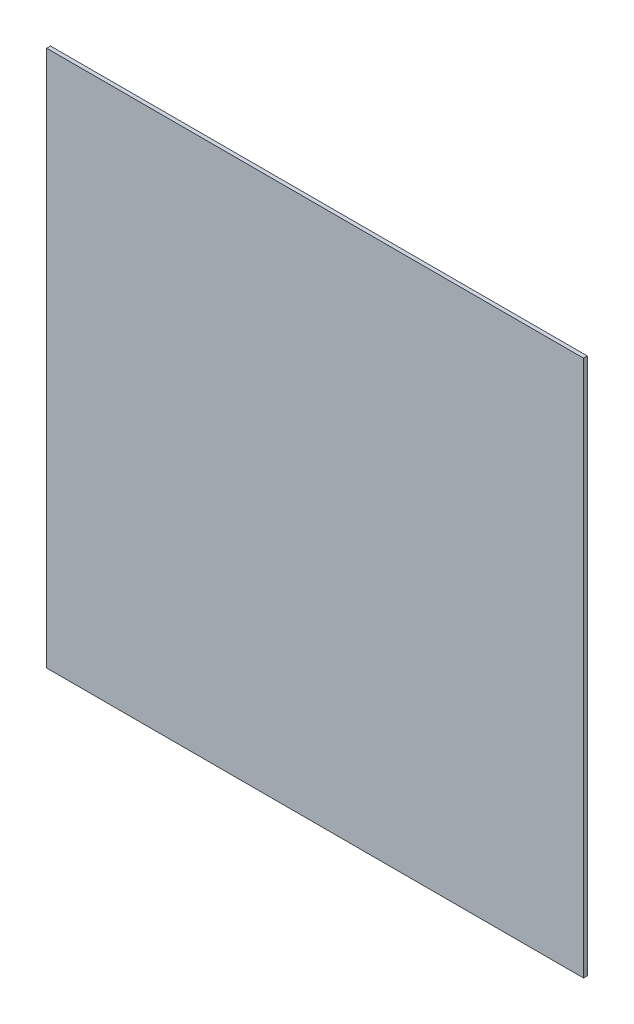
ISO-10303-21;
HEADER;
FILE_DESCRIPTION(('STEP AP214'),'2;1');
FILE_NAME('part.step','',(''),(''),'','','');
FILE_SCHEMA(('AUTOMOTIVE_DESIGN { 1 0 10303 214 1 1 1 1 }'));
ENDSEC;
DATA;
#1=APPLICATION_CONTEXT('core data for automotive mechanical design processes');
#2=APPLICATION_PROTOCOL_DEFINITION('international standard','automotive_design',2000,#1);
#3=PRODUCT_CONTEXT('',#1,'mechanical');
#4=PRODUCT('Part','Part','',(#3));
#5=PRODUCT_RELATED_PRODUCT_CATEGORY('part','',(#4));
#6=PRODUCT_DEFINITION_FORMATION('','',#4);
#7=PRODUCT_DEFINITION_CONTEXT('part definition',#1,'design');
#8=PRODUCT_DEFINITION('design','',#6,#7);
#9=PRODUCT_DEFINITION_SHAPE('','',#8);
#10=(LENGTH_UNIT() NAMED_UNIT(*) SI_UNIT(.MILLI.,.METRE.));
#11=(NAMED_UNIT(*) PLANE_ANGLE_UNIT() SI_UNIT($,.RADIAN.));
#12=(NAMED_UNIT(*) SI_UNIT($,.STERADIAN.) SOLID_ANGLE_UNIT());
#13=UNCERTAINTY_MEASURE_WITH_UNIT(LENGTH_MEASURE(1.E-05),#10,'distance_accuracy_value','');
#14=(GEOMETRIC_REPRESENTATION_CONTEXT(3) GLOBAL_UNCERTAINTY_ASSIGNED_CONTEXT((#13)) GLOBAL_UNIT_ASSIGNED_CONTEXT((#10,
#11,#12)) REPRESENTATION_CONTEXT('',''));
#15=CARTESIAN_POINT('',(0.,0.,0.));
#16=DIRECTION('',(0.,0.,1.));
#17=DIRECTION('',(1.,0.,0.));
#18=AXIS2_PLACEMENT_3D('',#15,#16,#17);
#19=CARTESIAN_POINT('',(210.,-210.,3.));
#20=DIRECTION('',(-1.,0.,0.));
#21=DIRECTION('',(0.,0.,1.));
#22=AXIS2_PLACEMENT_3D('',#19,#20,#21);
#23=PLANE('',#22);
#24=DIRECTION('',(0.,1.,0.));
#25=VECTOR('',#24,1.);
#26=CARTESIAN_POINT('',(210.,-210.,0.));
#27=LINE('',#26,#25);
#28=CARTESIAN_POINT('',(210.,-210.,0.));
#29=VERTEX_POINT('',#28);
#30=CARTESIAN_POINT('',(210.,210.,0.));
#31=VERTEX_POINT('',#30);
#32=EDGE_CURVE('E107',#29,#31,#27,.T.);
#33=ORIENTED_EDGE('',*,*,#32,.T.);
#34=DIRECTION('',(0.,0.,-1.));
#35=VECTOR('',#34,1.);
#36=CARTESIAN_POINT('',(210.,210.,3.));
#37=LINE('',#36,#35);
#38=CARTESIAN_POINT('',(210.,210.,3.));
#39=VERTEX_POINT('',#38);
#40=EDGE_CURVE('E11',#39,#31,#37,.T.);
#41=ORIENTED_EDGE('',*,*,#40,.F.);
#42=DIRECTION('',(0.,1.,0.));
#43=VECTOR('',#42,1.);
#44=CARTESIAN_POINT('',(210.,-210.,3.));
#45=LINE('',#44,#43);
#46=CARTESIAN_POINT('',(210.,-210.,3.));
#47=VERTEX_POINT('',#46);
#48=EDGE_CURVE('E91',#47,#39,#45,.T.);
#49=ORIENTED_EDGE('',*,*,#48,.F.);
#50=DIRECTION('',(0.,0.,-1.));
#51=VECTOR('',#50,1.);
#52=CARTESIAN_POINT('',(210.,-210.,3.));
#53=LINE('',#52,#51);
#54=EDGE_CURVE('E103',#47,#29,#53,.T.);
#55=ORIENTED_EDGE('',*,*,#54,.T.);
#56=EDGE_LOOP('',(#33,#41,#49,#55));
#57=FACE_BOUND('',#56,.T.);
#58=ADVANCED_FACE('F39',(#57),#23,.F.);
#59=CARTESIAN_POINT('',(-210.,210.,3.));
#60=DIRECTION('',(0.,-1.,0.));
#61=DIRECTION('',(0.,0.,-1.));
#62=AXIS2_PLACEMENT_3D('',#59,#60,#61);
#63=PLANE('',#62);
#64=DIRECTION('',(-1.,0.,0.));
#65=VECTOR('',#64,1.);
#66=CARTESIAN_POINT('',(-210.,210.,0.));
#67=LINE('',#66,#65);
#68=CARTESIAN_POINT('',(-210.,210.,0.));
#69=VERTEX_POINT('',#68);
#70=EDGE_CURVE('E96',#31,#69,#67,.T.);
#71=ORIENTED_EDGE('',*,*,#70,.T.);
#72=DIRECTION('',(0.,0.,-1.));
#73=VECTOR('',#72,1.);
#74=CARTESIAN_POINT('',(-210.,210.,3.));
#75=LINE('',#74,#73);
#76=CARTESIAN_POINT('',(-210.,210.,3.));
#77=VERTEX_POINT('',#76);
#78=EDGE_CURVE('E48',#77,#69,#75,.T.);
#79=ORIENTED_EDGE('',*,*,#78,.F.);
#80=DIRECTION('',(-1.,0.,0.));
#81=VECTOR('',#80,1.);
#82=CARTESIAN_POINT('',(-210.,210.,3.));
#83=LINE('',#82,#81);
#84=EDGE_CURVE('E86',#39,#77,#83,.T.);
#85=ORIENTED_EDGE('',*,*,#84,.F.);
#86=ORIENTED_EDGE('',*,*,#40,.T.);
#87=EDGE_LOOP('',(#71,#79,#85,#86));
#88=FACE_BOUND('',#87,.T.);
#89=ADVANCED_FACE('F95',(#88),#63,.F.);
#90=CARTESIAN_POINT('',(-210.,-210.,3.));
#91=DIRECTION('',(1.,0.,0.));
#92=DIRECTION('',(0.,0.,-1.));
#93=AXIS2_PLACEMENT_3D('',#90,#91,#92);
#94=PLANE('',#93);
#95=DIRECTION('',(0.,-1.,0.));
#96=VECTOR('',#95,1.);
#97=CARTESIAN_POINT('',(-210.,-210.,0.));
#98=LINE('',#97,#96);
#99=CARTESIAN_POINT('',(-210.,-210.,0.));
#100=VERTEX_POINT('',#99);
#101=EDGE_CURVE('E73',#69,#100,#98,.T.);
#102=ORIENTED_EDGE('',*,*,#101,.T.);
#103=DIRECTION('',(0.,0.,-1.));
#104=VECTOR('',#103,1.);
#105=CARTESIAN_POINT('',(-210.,-210.,3.));
#106=LINE('',#105,#104);
#107=CARTESIAN_POINT('',(-210.,-210.,3.));
#108=VERTEX_POINT('',#107);
#109=EDGE_CURVE('E98',#108,#100,#106,.T.);
#110=ORIENTED_EDGE('',*,*,#109,.F.);
#111=DIRECTION('',(0.,-1.,0.));
#112=VECTOR('',#111,1.);
#113=CARTESIAN_POINT('',(-210.,-210.,3.));
#114=LINE('',#113,#112);
#115=EDGE_CURVE('E89',#77,#108,#114,.T.);
#116=ORIENTED_EDGE('',*,*,#115,.F.);
#117=ORIENTED_EDGE('',*,*,#78,.T.);
#118=EDGE_LOOP('',(#102,#110,#116,#117));
#119=FACE_BOUND('',#118,.T.);
#120=ADVANCED_FACE('F99',(#119),#94,.F.);
#121=CARTESIAN_POINT('',(-210.,-210.,3.));
#122=DIRECTION('',(0.,1.,0.));
#123=DIRECTION('',(0.,0.,1.));
#124=AXIS2_PLACEMENT_3D('',#121,#122,#123);
#125=PLANE('',#124);
#126=DIRECTION('',(1.,0.,0.));
#127=VECTOR('',#126,1.);
#128=CARTESIAN_POINT('',(-210.,-210.,0.));
#129=LINE('',#128,#127);
#130=EDGE_CURVE('E79',#100,#29,#129,.T.);
#131=ORIENTED_EDGE('',*,*,#130,.T.);
#132=ORIENTED_EDGE('',*,*,#54,.F.);
#133=DIRECTION('',(1.,0.,0.));
#134=VECTOR('',#133,1.);
#135=CARTESIAN_POINT('',(-210.,-210.,3.));
#136=LINE('',#135,#134);
#137=EDGE_CURVE('E56',#108,#47,#136,.T.);
#138=ORIENTED_EDGE('',*,*,#137,.F.);
#139=ORIENTED_EDGE('',*,*,#109,.T.);
#140=EDGE_LOOP('',(#131,#132,#138,#139));
#141=FACE_BOUND('',#140,.T.);
#142=ADVANCED_FACE('F120',(#141),#125,.F.);
#143=CARTESIAN_POINT('',(0.,0.,3.));
#144=DIRECTION('',(0.,0.,-1.));
#145=DIRECTION('',(-1.,0.,0.));
#146=AXIS2_PLACEMENT_3D('',#143,#144,#145);
#147=PLANE('',#146);
#148=ORIENTED_EDGE('',*,*,#48,.T.);
#149=ORIENTED_EDGE('',*,*,#84,.T.);
#150=ORIENTED_EDGE('',*,*,#115,.T.);
#151=ORIENTED_EDGE('',*,*,#137,.T.);
#152=EDGE_LOOP('',(#148,#149,#150,#151));
#153=FACE_BOUND('',#152,.T.);
#154=ADVANCED_FACE('F87',(#153),#147,.F.);
#155=CARTESIAN_POINT('',(0.,0.,0.));
#156=DIRECTION('',(0.,0.,-1.));
#157=DIRECTION('',(-1.,0.,0.));
#158=AXIS2_PLACEMENT_3D('',#155,#156,#157);
#159=PLANE('',#158);
#160=ORIENTED_EDGE('',*,*,#32,.F.);
#161=ORIENTED_EDGE('',*,*,#130,.F.);
#162=ORIENTED_EDGE('',*,*,#101,.F.);
#163=ORIENTED_EDGE('',*,*,#70,.F.);
#164=EDGE_LOOP('',(#160,#161,#162,#163));
#165=FACE_BOUND('',#164,.T.);
#166=ADVANCED_FACE('F123',(#165),#159,.T.);
#167=CLOSED_SHELL('',(#58,#89,#120,#142,#154,#166));
#168=MANIFOLD_SOLID_BREP('B2',#167);
#169=ADVANCED_BREP_SHAPE_REPRESENTATION('',(#18,#168),#14);
#170=SHAPE_DEFINITION_REPRESENTATION(#9,#169);
ENDSEC;
END-ISO-10303-21;
